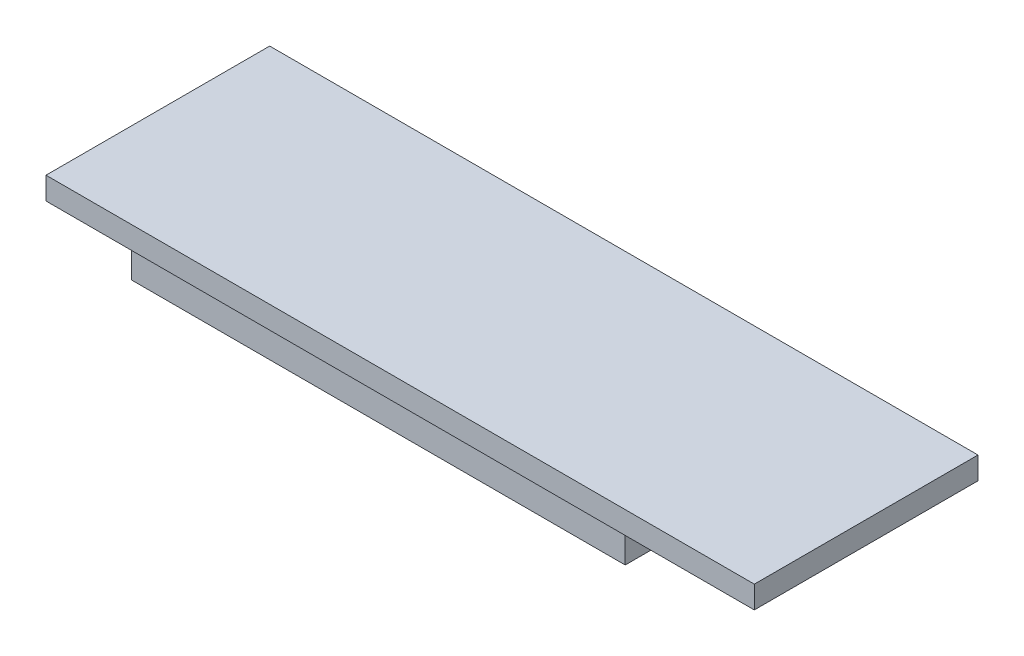
ISO-10303-21;
HEADER;
FILE_DESCRIPTION(('STEP AP214'),'2;1');
FILE_NAME('part.step','',(''),(''),'','','');
FILE_SCHEMA(('AUTOMOTIVE_DESIGN { 1 0 10303 214 1 1 1 1 }'));
ENDSEC;
DATA;
#1=APPLICATION_CONTEXT('core data for automotive mechanical design processes');
#2=APPLICATION_PROTOCOL_DEFINITION('international standard','automotive_design',2000,#1);
#3=PRODUCT_CONTEXT('',#1,'mechanical');
#4=PRODUCT('Part','Part','',(#3));
#5=PRODUCT_RELATED_PRODUCT_CATEGORY('part','',(#4));
#6=PRODUCT_DEFINITION_FORMATION('','',#4);
#7=PRODUCT_DEFINITION_CONTEXT('part definition',#1,'design');
#8=PRODUCT_DEFINITION('design','',#6,#7);
#9=PRODUCT_DEFINITION_SHAPE('','',#8);
#10=(LENGTH_UNIT() NAMED_UNIT(*) SI_UNIT(.MILLI.,.METRE.));
#11=(NAMED_UNIT(*) PLANE_ANGLE_UNIT() SI_UNIT($,.RADIAN.));
#12=(NAMED_UNIT(*) SI_UNIT($,.STERADIAN.) SOLID_ANGLE_UNIT());
#13=UNCERTAINTY_MEASURE_WITH_UNIT(LENGTH_MEASURE(1.E-05),#10,'distance_accuracy_value','');
#14=(GEOMETRIC_REPRESENTATION_CONTEXT(3) GLOBAL_UNCERTAINTY_ASSIGNED_CONTEXT((#13)) GLOBAL_UNIT_ASSIGNED_CONTEXT((#10,
#11,#12)) REPRESENTATION_CONTEXT('',''));
#15=CARTESIAN_POINT('',(0.,0.,0.));
#16=DIRECTION('',(0.,0.,1.));
#17=DIRECTION('',(1.,0.,0.));
#18=AXIS2_PLACEMENT_3D('',#15,#16,#17);
#19=CARTESIAN_POINT('',(0.,-0.6,0.));
#20=DIRECTION('',(0.,-1.,0.));
#21=DIRECTION('',(0.,0.,-1.));
#22=AXIS2_PLACEMENT_3D('',#19,#20,#21);
#23=PLANE('',#22);
#24=DIRECTION('',(0.,0.,-1.));
#25=VECTOR('',#24,1.);
#26=CARTESIAN_POINT('',(19.,-0.6,6.00000000000001));
#27=LINE('',#26,#25);
#28=CARTESIAN_POINT('',(19.,-0.6,6.00000000000001));
#29=VERTEX_POINT('',#28);
#30=CARTESIAN_POINT('',(19.,-0.6,-6.));
#31=VERTEX_POINT('',#30);
#32=EDGE_CURVE('E130',#29,#31,#27,.T.);
#33=ORIENTED_EDGE('',*,*,#32,.F.);
#34=DIRECTION('',(1.,0.,0.));
#35=VECTOR('',#34,1.);
#36=CARTESIAN_POINT('',(-19.,-0.6,6.));
#37=LINE('',#36,#35);
#38=CARTESIAN_POINT('',(-19.,-0.6,6.));
#39=VERTEX_POINT('',#38);
#40=EDGE_CURVE('E139',#39,#29,#37,.T.);
#41=ORIENTED_EDGE('',*,*,#40,.F.);
#42=DIRECTION('',(0.,0.,1.));
#43=VECTOR('',#42,1.);
#44=CARTESIAN_POINT('',(-19.,-0.6,6.));
#45=LINE('',#44,#43);
#46=CARTESIAN_POINT('',(-19.,-0.6,-6.));
#47=VERTEX_POINT('',#46);
#48=EDGE_CURVE('E150',#47,#39,#45,.T.);
#49=ORIENTED_EDGE('',*,*,#48,.F.);
#50=DIRECTION('',(-1.,0.,0.));
#51=VECTOR('',#50,1.);
#52=CARTESIAN_POINT('',(-19.,-0.6,-6.));
#53=LINE('',#52,#51);
#54=EDGE_CURVE('E148',#31,#47,#53,.T.);
#55=ORIENTED_EDGE('',*,*,#54,.F.);
#56=EDGE_LOOP('',(#33,#41,#49,#55));
#57=FACE_BOUND('',#56,.T.);
#58=DIRECTION('',(0.,0.,-1.));
#59=VECTOR('',#58,1.);
#60=CARTESIAN_POINT('',(-14.65,-0.6,5.775));
#61=LINE('',#60,#59);
#62=CARTESIAN_POINT('',(-14.65,-0.6,5.775));
#63=VERTEX_POINT('',#62);
#64=CARTESIAN_POINT('',(-14.65,-0.6,-5.775));
#65=VERTEX_POINT('',#64);
#66=EDGE_CURVE('E117',#63,#65,#61,.T.);
#67=ORIENTED_EDGE('',*,*,#66,.F.);
#68=DIRECTION('',(1.,0.,0.));
#69=VECTOR('',#68,1.);
#70=CARTESIAN_POINT('',(-14.65,-0.6,5.775));
#71=LINE('',#70,#69);
#72=CARTESIAN_POINT('',(11.85,-0.6,5.775));
#73=VERTEX_POINT('',#72);
#74=EDGE_CURVE('E48',#63,#73,#71,.T.);
#75=ORIENTED_EDGE('',*,*,#74,.T.);
#76=DIRECTION('',(0.,0.,-1.));
#77=VECTOR('',#76,1.);
#78=CARTESIAN_POINT('',(11.85,-0.6,5.775));
#79=LINE('',#78,#77);
#80=CARTESIAN_POINT('',(11.85,-0.6,-5.775));
#81=VERTEX_POINT('',#80);
#82=EDGE_CURVE('E53',#73,#81,#79,.T.);
#83=ORIENTED_EDGE('',*,*,#82,.T.);
#84=DIRECTION('',(1.,0.,0.));
#85=VECTOR('',#84,1.);
#86=CARTESIAN_POINT('',(-14.65,-0.6,-5.775));
#87=LINE('',#86,#85);
#88=EDGE_CURVE('E120',#65,#81,#87,.T.);
#89=ORIENTED_EDGE('',*,*,#88,.F.);
#90=EDGE_LOOP('',(#67,#75,#83,#89));
#91=FACE_BOUND('',#90,.T.);
#92=ADVANCED_FACE('F33',(#57,#91),#23,.T.);
#93=CARTESIAN_POINT('',(19.,0.6,6.00000000000001));
#94=DIRECTION('',(-1.,0.,0.));
#95=DIRECTION('',(0.,0.,1.));
#96=AXIS2_PLACEMENT_3D('',#93,#94,#95);
#97=PLANE('',#96);
#98=ORIENTED_EDGE('',*,*,#32,.T.);
#99=DIRECTION('',(0.,-1.,0.));
#100=VECTOR('',#99,1.);
#101=CARTESIAN_POINT('',(19.,0.6,-6.));
#102=LINE('',#101,#100);
#103=CARTESIAN_POINT('',(19.,0.6,-6.));
#104=VERTEX_POINT('',#103);
#105=EDGE_CURVE('E11',#104,#31,#102,.T.);
#106=ORIENTED_EDGE('',*,*,#105,.F.);
#107=DIRECTION('',(0.,0.,-1.));
#108=VECTOR('',#107,1.);
#109=CARTESIAN_POINT('',(19.,0.6,6.00000000000001));
#110=LINE('',#109,#108);
#111=CARTESIAN_POINT('',(19.,0.6,6.00000000000001));
#112=VERTEX_POINT('',#111);
#113=EDGE_CURVE('E135',#112,#104,#110,.T.);
#114=ORIENTED_EDGE('',*,*,#113,.F.);
#115=DIRECTION('',(0.,-1.,0.));
#116=VECTOR('',#115,1.);
#117=CARTESIAN_POINT('',(19.,0.6,6.00000000000001));
#118=LINE('',#117,#116);
#119=EDGE_CURVE('E145',#112,#29,#118,.T.);
#120=ORIENTED_EDGE('',*,*,#119,.T.);
#121=EDGE_LOOP('',(#98,#106,#114,#120));
#122=FACE_BOUND('',#121,.T.);
#123=ADVANCED_FACE('F35',(#122),#97,.F.);
#124=CARTESIAN_POINT('',(-19.,0.6,-6.));
#125=DIRECTION('',(0.,0.,1.));
#126=DIRECTION('',(1.,0.,0.));
#127=AXIS2_PLACEMENT_3D('',#124,#125,#126);
#128=PLANE('',#127);
#129=ORIENTED_EDGE('',*,*,#54,.T.);
#130=DIRECTION('',(0.,-1.,0.));
#131=VECTOR('',#130,1.);
#132=CARTESIAN_POINT('',(-19.,0.6,-6.));
#133=LINE('',#132,#131);
#134=CARTESIAN_POINT('',(-19.,0.6,-6.));
#135=VERTEX_POINT('',#134);
#136=EDGE_CURVE('E41',#135,#47,#133,.T.);
#137=ORIENTED_EDGE('',*,*,#136,.F.);
#138=DIRECTION('',(-1.,0.,0.));
#139=VECTOR('',#138,1.);
#140=CARTESIAN_POINT('',(-19.,0.6,-6.));
#141=LINE('',#140,#139);
#142=EDGE_CURVE('E138',#104,#135,#141,.T.);
#143=ORIENTED_EDGE('',*,*,#142,.F.);
#144=ORIENTED_EDGE('',*,*,#105,.T.);
#145=EDGE_LOOP('',(#129,#137,#143,#144));
#146=FACE_BOUND('',#145,.T.);
#147=ADVANCED_FACE('F177',(#146),#128,.F.);
#148=CARTESIAN_POINT('',(-19.,0.6,6.));
#149=DIRECTION('',(1.,0.,0.));
#150=DIRECTION('',(0.,0.,-1.));
#151=AXIS2_PLACEMENT_3D('',#148,#149,#150);
#152=PLANE('',#151);
#153=ORIENTED_EDGE('',*,*,#48,.T.);
#154=DIRECTION('',(0.,-1.,0.));
#155=VECTOR('',#154,1.);
#156=CARTESIAN_POINT('',(-19.,0.6,6.));
#157=LINE('',#156,#155);
#158=CARTESIAN_POINT('',(-19.,0.6,6.));
#159=VERTEX_POINT('',#158);
#160=EDGE_CURVE('E155',#159,#39,#157,.T.);
#161=ORIENTED_EDGE('',*,*,#160,.F.);
#162=DIRECTION('',(0.,0.,1.));
#163=VECTOR('',#162,1.);
#164=CARTESIAN_POINT('',(-19.,0.6,6.));
#165=LINE('',#164,#163);
#166=EDGE_CURVE('E141',#135,#159,#165,.T.);
#167=ORIENTED_EDGE('',*,*,#166,.F.);
#168=ORIENTED_EDGE('',*,*,#136,.T.);
#169=EDGE_LOOP('',(#153,#161,#167,#168));
#170=FACE_BOUND('',#169,.T.);
#171=ADVANCED_FACE('F162',(#170),#152,.F.);
#172=CARTESIAN_POINT('',(-19.,0.6,6.));
#173=DIRECTION('',(0.,0.,-1.));
#174=DIRECTION('',(-1.,0.,0.));
#175=AXIS2_PLACEMENT_3D('',#172,#173,#174);
#176=PLANE('',#175);
#177=ORIENTED_EDGE('',*,*,#40,.T.);
#178=ORIENTED_EDGE('',*,*,#119,.F.);
#179=DIRECTION('',(1.,0.,0.));
#180=VECTOR('',#179,1.);
#181=CARTESIAN_POINT('',(-19.,0.6,6.));
#182=LINE('',#181,#180);
#183=EDGE_CURVE('E143',#159,#112,#182,.T.);
#184=ORIENTED_EDGE('',*,*,#183,.F.);
#185=ORIENTED_EDGE('',*,*,#160,.T.);
#186=EDGE_LOOP('',(#177,#178,#184,#185));
#187=FACE_BOUND('',#186,.T.);
#188=ADVANCED_FACE('F170',(#187),#176,.F.);
#189=CARTESIAN_POINT('',(0.,0.6,0.));
#190=DIRECTION('',(0.,-1.,0.));
#191=DIRECTION('',(0.,0.,-1.));
#192=AXIS2_PLACEMENT_3D('',#189,#190,#191);
#193=PLANE('',#192);
#194=ORIENTED_EDGE('',*,*,#113,.T.);
#195=ORIENTED_EDGE('',*,*,#142,.T.);
#196=ORIENTED_EDGE('',*,*,#166,.T.);
#197=ORIENTED_EDGE('',*,*,#183,.T.);
#198=EDGE_LOOP('',(#194,#195,#196,#197));
#199=FACE_BOUND('',#198,.T.);
#200=ADVANCED_FACE('F176',(#199),#193,.F.);
#201=CARTESIAN_POINT('',(-14.65,-2.2,5.775));
#202=DIRECTION('',(0.,0.,1.));
#203=DIRECTION('',(1.,0.,0.));
#204=AXIS2_PLACEMENT_3D('',#201,#202,#203);
#205=PLANE('',#204);
#206=ORIENTED_EDGE('',*,*,#74,.F.);
#207=DIRECTION('',(0.,1.,0.));
#208=VECTOR('',#207,1.);
#209=CARTESIAN_POINT('',(-14.65,-2.2,5.775));
#210=LINE('',#209,#208);
#211=CARTESIAN_POINT('',(-14.65,-2.2,5.775));
#212=VERTEX_POINT('',#211);
#213=EDGE_CURVE('E115',#212,#63,#210,.T.);
#214=ORIENTED_EDGE('',*,*,#213,.F.);
#215=DIRECTION('',(1.,0.,0.));
#216=VECTOR('',#215,1.);
#217=CARTESIAN_POINT('',(-14.65,-2.2,5.775));
#218=LINE('',#217,#216);
#219=CARTESIAN_POINT('',(11.85,-2.2,5.775));
#220=VERTEX_POINT('',#219);
#221=EDGE_CURVE('E108',#212,#220,#218,.T.);
#222=ORIENTED_EDGE('',*,*,#221,.T.);
#223=DIRECTION('',(0.,1.,0.));
#224=VECTOR('',#223,1.);
#225=CARTESIAN_POINT('',(11.85,-2.2,5.775));
#226=LINE('',#225,#224);
#227=EDGE_CURVE('E96',#220,#73,#226,.T.);
#228=ORIENTED_EDGE('',*,*,#227,.T.);
#229=EDGE_LOOP('',(#206,#214,#222,#228));
#230=FACE_BOUND('',#229,.T.);
#231=ADVANCED_FACE('F113',(#230),#205,.T.);
#232=CARTESIAN_POINT('',(-14.65,-2.2,5.775));
#233=DIRECTION('',(1.,0.,0.));
#234=DIRECTION('',(0.,0.,-1.));
#235=AXIS2_PLACEMENT_3D('',#232,#233,#234);
#236=PLANE('',#235);
#237=ORIENTED_EDGE('',*,*,#66,.T.);
#238=DIRECTION('',(0.,1.,0.));
#239=VECTOR('',#238,1.);
#240=CARTESIAN_POINT('',(-14.65,-2.2,-5.775));
#241=LINE('',#240,#239);
#242=CARTESIAN_POINT('',(-14.65,-2.2,-5.775));
#243=VERTEX_POINT('',#242);
#244=EDGE_CURVE('E131',#243,#65,#241,.T.);
#245=ORIENTED_EDGE('',*,*,#244,.F.);
#246=DIRECTION('',(0.,0.,-1.));
#247=VECTOR('',#246,1.);
#248=CARTESIAN_POINT('',(-14.65,-2.2,5.775));
#249=LINE('',#248,#247);
#250=EDGE_CURVE('E103',#212,#243,#249,.T.);
#251=ORIENTED_EDGE('',*,*,#250,.F.);
#252=ORIENTED_EDGE('',*,*,#213,.T.);
#253=EDGE_LOOP('',(#237,#245,#251,#252));
#254=FACE_BOUND('',#253,.T.);
#255=ADVANCED_FACE('F198',(#254),#236,.F.);
#256=CARTESIAN_POINT('',(-14.65,-2.2,-5.775));
#257=DIRECTION('',(0.,0.,1.));
#258=DIRECTION('',(1.,0.,0.));
#259=AXIS2_PLACEMENT_3D('',#256,#257,#258);
#260=PLANE('',#259);
#261=ORIENTED_EDGE('',*,*,#88,.T.);
#262=DIRECTION('',(0.,1.,0.));
#263=VECTOR('',#262,1.);
#264=CARTESIAN_POINT('',(11.85,-2.2,-5.775));
#265=LINE('',#264,#263);
#266=CARTESIAN_POINT('',(11.85,-2.2,-5.775));
#267=VERTEX_POINT('',#266);
#268=EDGE_CURVE('E102',#267,#81,#265,.T.);
#269=ORIENTED_EDGE('',*,*,#268,.F.);
#270=DIRECTION('',(1.,0.,0.));
#271=VECTOR('',#270,1.);
#272=CARTESIAN_POINT('',(-14.65,-2.2,-5.775));
#273=LINE('',#272,#271);
#274=EDGE_CURVE('E110',#243,#267,#273,.T.);
#275=ORIENTED_EDGE('',*,*,#274,.F.);
#276=ORIENTED_EDGE('',*,*,#244,.T.);
#277=EDGE_LOOP('',(#261,#269,#275,#276));
#278=FACE_BOUND('',#277,.T.);
#279=ADVANCED_FACE('F202',(#278),#260,.F.);
#280=CARTESIAN_POINT('',(11.85,-2.2,5.775));
#281=DIRECTION('',(1.,0.,0.));
#282=DIRECTION('',(0.,0.,-1.));
#283=AXIS2_PLACEMENT_3D('',#280,#281,#282);
#284=PLANE('',#283);
#285=ORIENTED_EDGE('',*,*,#82,.F.);
#286=ORIENTED_EDGE('',*,*,#227,.F.);
#287=DIRECTION('',(0.,0.,-1.));
#288=VECTOR('',#287,1.);
#289=CARTESIAN_POINT('',(11.85,-2.2,5.775));
#290=LINE('',#289,#288);
#291=EDGE_CURVE('E99',#220,#267,#290,.T.);
#292=ORIENTED_EDGE('',*,*,#291,.T.);
#293=ORIENTED_EDGE('',*,*,#268,.T.);
#294=EDGE_LOOP('',(#285,#286,#292,#293));
#295=FACE_BOUND('',#294,.T.);
#296=ADVANCED_FACE('F98',(#295),#284,.T.);
#297=CARTESIAN_POINT('',(0.,-2.2,0.));
#298=DIRECTION('',(0.,1.,0.));
#299=DIRECTION('',(0.,0.,1.));
#300=AXIS2_PLACEMENT_3D('',#297,#298,#299);
#301=PLANE('',#300);
#302=ORIENTED_EDGE('',*,*,#221,.F.);
#303=ORIENTED_EDGE('',*,*,#250,.T.);
#304=ORIENTED_EDGE('',*,*,#274,.T.);
#305=ORIENTED_EDGE('',*,*,#291,.F.);
#306=EDGE_LOOP('',(#302,#303,#304,#305));
#307=FACE_BOUND('',#306,.T.);
#308=ADVANCED_FACE('F107',(#307),#301,.F.);
#309=CLOSED_SHELL('',(#92,#123,#147,#171,#188,#200,#231,#255,#279,#296,#308));
#310=MANIFOLD_SOLID_BREP('B2',#309);
#311=ADVANCED_BREP_SHAPE_REPRESENTATION('',(#18,#310),#14);
#312=SHAPE_DEFINITION_REPRESENTATION(#9,#311);
ENDSEC;
END-ISO-10303-21;
